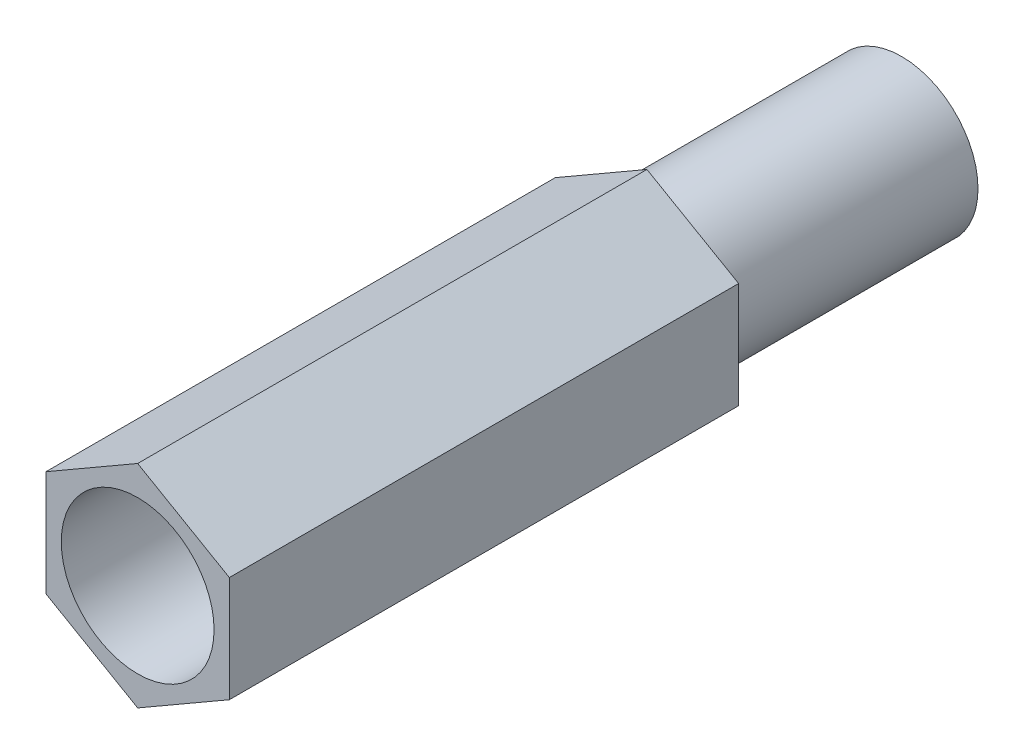
ISO-10303-21;
HEADER;
FILE_DESCRIPTION(('STEP AP214'),'2;1');
FILE_NAME('part.step','',(''),(''),'','','');
FILE_SCHEMA(('AUTOMOTIVE_DESIGN { 1 0 10303 214 1 1 1 1 }'));
ENDSEC;
DATA;
#1=APPLICATION_CONTEXT('core data for automotive mechanical design processes');
#2=APPLICATION_PROTOCOL_DEFINITION('international standard','automotive_design',2000,#1);
#3=PRODUCT_CONTEXT('',#1,'mechanical');
#4=PRODUCT('Part','Part','',(#3));
#5=PRODUCT_RELATED_PRODUCT_CATEGORY('part','',(#4));
#6=PRODUCT_DEFINITION_FORMATION('','',#4);
#7=PRODUCT_DEFINITION_CONTEXT('part definition',#1,'design');
#8=PRODUCT_DEFINITION('design','',#6,#7);
#9=PRODUCT_DEFINITION_SHAPE('','',#8);
#10=(LENGTH_UNIT() NAMED_UNIT(*) SI_UNIT(.MILLI.,.METRE.));
#11=(NAMED_UNIT(*) PLANE_ANGLE_UNIT() SI_UNIT($,.RADIAN.));
#12=(NAMED_UNIT(*) SI_UNIT($,.STERADIAN.) SOLID_ANGLE_UNIT());
#13=UNCERTAINTY_MEASURE_WITH_UNIT(LENGTH_MEASURE(1.E-05),#10,'distance_accuracy_value','');
#14=(GEOMETRIC_REPRESENTATION_CONTEXT(3) GLOBAL_UNCERTAINTY_ASSIGNED_CONTEXT((#13)) GLOBAL_UNIT_ASSIGNED_CONTEXT((#10,
#11,#12)) REPRESENTATION_CONTEXT('',''));
#15=CARTESIAN_POINT('',(0.,0.,0.));
#16=DIRECTION('',(0.,0.,1.));
#17=DIRECTION('',(1.,0.,0.));
#18=AXIS2_PLACEMENT_3D('',#15,#16,#17);
#19=CARTESIAN_POINT('',(0.,0.,10.));
#20=DIRECTION('',(0.,0.,-1.));
#21=DIRECTION('',(-1.,0.,0.));
#22=AXIS2_PLACEMENT_3D('',#19,#20,#21);
#23=CYLINDRICAL_SURFACE('',#22,1.5);
#24=CARTESIAN_POINT('',(0.,0.,10.));
#25=DIRECTION('',(0.,0.,1.));
#26=DIRECTION('',(1.,0.,0.));
#27=AXIS2_PLACEMENT_3D('',#24,#25,#26);
#28=CIRCLE('',#27,1.5);
#29=CARTESIAN_POINT('',(1.5,0.,10.));
#30=VERTEX_POINT('',#29);
#31=EDGE_CURVE('E141',#30,#30,#28,.T.);
#32=ORIENTED_EDGE('',*,*,#31,.T.);
#33=EDGE_LOOP('',(#32));
#34=FACE_BOUND('',#33,.T.);
#35=CARTESIAN_POINT('',(0.,0.,5.));
#36=DIRECTION('',(0.,0.,-1.));
#37=DIRECTION('',(-1.,0.,0.));
#38=AXIS2_PLACEMENT_3D('',#35,#36,#37);
#39=CIRCLE('',#38,1.5);
#40=CARTESIAN_POINT('',(-1.5,0.,5.));
#41=VERTEX_POINT('',#40);
#42=EDGE_CURVE('E258',#41,#41,#39,.T.);
#43=ORIENTED_EDGE('',*,*,#42,.T.);
#44=EDGE_LOOP('',(#43));
#45=FACE_BOUND('',#44,.T.);
#46=ADVANCED_FACE('F45',(#34,#45),#23,.F.);
#47=CARTESIAN_POINT('',(0.,0.,10.));
#48=DIRECTION('',(0.,0.,1.));
#49=DIRECTION('',(1.,0.,0.));
#50=AXIS2_PLACEMENT_3D('',#47,#48,#49);
#51=PLANE('',#50);
#52=DIRECTION('',(-0.866025403784439,0.5,0.));
#53=VECTOR('',#52,1.);
#54=CARTESIAN_POINT('',(1.8,1.03923048454133,10.));
#55=LINE('',#54,#53);
#56=CARTESIAN_POINT('',(1.8,1.03923048454133,10.));
#57=VERTEX_POINT('',#56);
#58=CARTESIAN_POINT('',(0.,2.07846096908265,10.));
#59=VERTEX_POINT('',#58);
#60=EDGE_CURVE('E153',#57,#59,#55,.T.);
#61=ORIENTED_EDGE('',*,*,#60,.T.);
#62=DIRECTION('',(-0.866025403784439,-0.5,0.));
#63=VECTOR('',#62,1.);
#64=CARTESIAN_POINT('',(0.,2.07846096908265,10.));
#65=LINE('',#64,#63);
#66=CARTESIAN_POINT('',(-1.8,1.03923048454133,10.));
#67=VERTEX_POINT('',#66);
#68=EDGE_CURVE('E100',#59,#67,#65,.T.);
#69=ORIENTED_EDGE('',*,*,#68,.T.);
#70=DIRECTION('',(0.,-1.,0.));
#71=VECTOR('',#70,1.);
#72=CARTESIAN_POINT('',(-1.8,1.03923048454133,10.));
#73=LINE('',#72,#71);
#74=CARTESIAN_POINT('',(-1.8,-1.03923048454133,10.));
#75=VERTEX_POINT('',#74);
#76=EDGE_CURVE('E114',#67,#75,#73,.T.);
#77=ORIENTED_EDGE('',*,*,#76,.T.);
#78=DIRECTION('',(0.866025403784439,-0.5,0.));
#79=VECTOR('',#78,1.);
#80=CARTESIAN_POINT('',(-1.8,-1.03923048454133,10.));
#81=LINE('',#80,#79);
#82=CARTESIAN_POINT('',(0.,-2.07846096908265,10.));
#83=VERTEX_POINT('',#82);
#84=EDGE_CURVE('E107',#75,#83,#81,.T.);
#85=ORIENTED_EDGE('',*,*,#84,.T.);
#86=DIRECTION('',(0.866025403784439,0.5,0.));
#87=VECTOR('',#86,1.);
#88=CARTESIAN_POINT('',(0.,-2.07846096908265,10.));
#89=LINE('',#88,#87);
#90=CARTESIAN_POINT('',(1.8,-1.03923048454133,10.));
#91=VERTEX_POINT('',#90);
#92=EDGE_CURVE('E112',#83,#91,#89,.T.);
#93=ORIENTED_EDGE('',*,*,#92,.T.);
#94=DIRECTION('',(0.,1.,0.));
#95=VECTOR('',#94,1.);
#96=CARTESIAN_POINT('',(1.8,-1.03923048454133,10.));
#97=LINE('',#96,#95);
#98=EDGE_CURVE('E63',#91,#57,#97,.T.);
#99=ORIENTED_EDGE('',*,*,#98,.T.);
#100=EDGE_LOOP('',(#61,#69,#77,#85,#93,#99));
#101=FACE_BOUND('',#100,.T.);
#102=ORIENTED_EDGE('',*,*,#31,.F.);
#103=EDGE_LOOP('',(#102));
#104=FACE_BOUND('',#103,.T.);
#105=ADVANCED_FACE('F109',(#101,#104),#51,.T.);
#106=CARTESIAN_POINT('',(0.,0.,0.));
#107=DIRECTION('',(0.,0.,1.));
#108=DIRECTION('',(1.,0.,0.));
#109=AXIS2_PLACEMENT_3D('',#106,#107,#108);
#110=PLANE('',#109);
#111=DIRECTION('',(-0.866025403784439,0.5,0.));
#112=VECTOR('',#111,1.);
#113=CARTESIAN_POINT('',(1.8,1.03923048454133,0.));
#114=LINE('',#113,#112);
#115=CARTESIAN_POINT('',(1.8,1.03923048454133,0.));
#116=VERTEX_POINT('',#115);
#117=CARTESIAN_POINT('',(0.,2.07846096908265,0.));
#118=VERTEX_POINT('',#117);
#119=EDGE_CURVE('E136',#116,#118,#114,.T.);
#120=ORIENTED_EDGE('',*,*,#119,.F.);
#121=DIRECTION('',(0.,1.,0.));
#122=VECTOR('',#121,1.);
#123=CARTESIAN_POINT('',(1.8,-1.03923048454133,0.));
#124=LINE('',#123,#122);
#125=CARTESIAN_POINT('',(1.8,-1.03923048454133,0.));
#126=VERTEX_POINT('',#125);
#127=EDGE_CURVE('E92',#126,#116,#124,.T.);
#128=ORIENTED_EDGE('',*,*,#127,.F.);
#129=DIRECTION('',(0.866025403784439,0.5,0.));
#130=VECTOR('',#129,1.);
#131=CARTESIAN_POINT('',(0.,-2.07846096908265,0.));
#132=LINE('',#131,#130);
#133=CARTESIAN_POINT('',(0.,-2.07846096908265,0.));
#134=VERTEX_POINT('',#133);
#135=EDGE_CURVE('E86',#134,#126,#132,.T.);
#136=ORIENTED_EDGE('',*,*,#135,.F.);
#137=DIRECTION('',(0.866025403784439,-0.5,0.));
#138=VECTOR('',#137,1.);
#139=CARTESIAN_POINT('',(-1.8,-1.03923048454133,0.));
#140=LINE('',#139,#138);
#141=CARTESIAN_POINT('',(-1.8,-1.03923048454133,0.));
#142=VERTEX_POINT('',#141);
#143=EDGE_CURVE('E123',#142,#134,#140,.T.);
#144=ORIENTED_EDGE('',*,*,#143,.F.);
#145=DIRECTION('',(0.,-1.,0.));
#146=VECTOR('',#145,1.);
#147=CARTESIAN_POINT('',(-1.8,1.03923048454133,0.));
#148=LINE('',#147,#146);
#149=CARTESIAN_POINT('',(-1.8,1.03923048454133,0.));
#150=VERTEX_POINT('',#149);
#151=EDGE_CURVE('E144',#150,#142,#148,.T.);
#152=ORIENTED_EDGE('',*,*,#151,.F.);
#153=DIRECTION('',(-0.866025403784439,-0.5,0.));
#154=VECTOR('',#153,1.);
#155=CARTESIAN_POINT('',(0.,2.07846096908265,0.));
#156=LINE('',#155,#154);
#157=EDGE_CURVE('E140',#118,#150,#156,.T.);
#158=ORIENTED_EDGE('',*,*,#157,.F.);
#159=EDGE_LOOP('',(#120,#128,#136,#144,#152,#158));
#160=FACE_BOUND('',#159,.T.);
#161=CARTESIAN_POINT('',(0.,0.,0.));
#162=DIRECTION('',(0.,0.,1.));
#163=DIRECTION('',(1.,0.,0.));
#164=AXIS2_PLACEMENT_3D('',#161,#162,#163);
#165=CIRCLE('',#164,1.5);
#166=CARTESIAN_POINT('',(1.5,0.,0.));
#167=VERTEX_POINT('',#166);
#168=EDGE_CURVE('E257',#167,#167,#165,.F.);
#169=ORIENTED_EDGE('',*,*,#168,.F.);
#170=EDGE_LOOP('',(#169));
#171=FACE_BOUND('',#170,.T.);
#172=ADVANCED_FACE('F166',(#160,#171),#110,.F.);
#173=CARTESIAN_POINT('',(1.8,1.03923048454133,10.));
#174=DIRECTION('',(-0.5,-0.866025403784439,0.));
#175=DIRECTION('',(0.866025403784439,-0.5,0.));
#176=AXIS2_PLACEMENT_3D('',#173,#174,#175);
#177=PLANE('',#176);
#178=ORIENTED_EDGE('',*,*,#119,.T.);
#179=DIRECTION('',(0.,0.,-1.));
#180=VECTOR('',#179,1.);
#181=CARTESIAN_POINT('',(0.,2.07846096908265,10.));
#182=LINE('',#181,#180);
#183=EDGE_CURVE('E11',#59,#118,#182,.T.);
#184=ORIENTED_EDGE('',*,*,#183,.F.);
#185=ORIENTED_EDGE('',*,*,#60,.F.);
#186=DIRECTION('',(0.,0.,-1.));
#187=VECTOR('',#186,1.);
#188=CARTESIAN_POINT('',(1.8,1.03923048454133,10.));
#189=LINE('',#188,#187);
#190=EDGE_CURVE('E132',#57,#116,#189,.T.);
#191=ORIENTED_EDGE('',*,*,#190,.T.);
#192=EDGE_LOOP('',(#178,#184,#185,#191));
#193=FACE_BOUND('',#192,.T.);
#194=ADVANCED_FACE('F47',(#193),#177,.F.);
#195=CARTESIAN_POINT('',(0.,2.07846096908265,10.));
#196=DIRECTION('',(0.5,-0.866025403784438,0.));
#197=DIRECTION('',(0.866025403784439,0.5,0.));
#198=AXIS2_PLACEMENT_3D('',#195,#196,#197);
#199=PLANE('',#198);
#200=ORIENTED_EDGE('',*,*,#157,.T.);
#201=DIRECTION('',(0.,0.,-1.));
#202=VECTOR('',#201,1.);
#203=CARTESIAN_POINT('',(-1.8,1.03923048454133,10.));
#204=LINE('',#203,#202);
#205=EDGE_CURVE('E55',#67,#150,#204,.T.);
#206=ORIENTED_EDGE('',*,*,#205,.F.);
#207=ORIENTED_EDGE('',*,*,#68,.F.);
#208=ORIENTED_EDGE('',*,*,#183,.T.);
#209=EDGE_LOOP('',(#200,#206,#207,#208));
#210=FACE_BOUND('',#209,.T.);
#211=ADVANCED_FACE('F198',(#210),#199,.F.);
#212=CARTESIAN_POINT('',(-1.8,1.03923048454133,10.));
#213=DIRECTION('',(1.,0.,0.));
#214=DIRECTION('',(0.,1.,0.));
#215=AXIS2_PLACEMENT_3D('',#212,#213,#214);
#216=PLANE('',#215);
#217=ORIENTED_EDGE('',*,*,#151,.T.);
#218=DIRECTION('',(0.,0.,-1.));
#219=VECTOR('',#218,1.);
#220=CARTESIAN_POINT('',(-1.8,-1.03923048454133,10.));
#221=LINE('',#220,#219);
#222=EDGE_CURVE('E125',#75,#142,#221,.T.);
#223=ORIENTED_EDGE('',*,*,#222,.F.);
#224=ORIENTED_EDGE('',*,*,#76,.F.);
#225=ORIENTED_EDGE('',*,*,#205,.T.);
#226=EDGE_LOOP('',(#217,#223,#224,#225));
#227=FACE_BOUND('',#226,.T.);
#228=ADVANCED_FACE('F163',(#227),#216,.F.);
#229=CARTESIAN_POINT('',(-1.8,-1.03923048454133,10.));
#230=DIRECTION('',(0.5,0.866025403784439,0.));
#231=DIRECTION('',(-0.866025403784439,0.5,0.));
#232=AXIS2_PLACEMENT_3D('',#229,#230,#231);
#233=PLANE('',#232);
#234=ORIENTED_EDGE('',*,*,#143,.T.);
#235=DIRECTION('',(0.,0.,-1.));
#236=VECTOR('',#235,1.);
#237=CARTESIAN_POINT('',(0.,-2.07846096908265,10.));
#238=LINE('',#237,#236);
#239=EDGE_CURVE('E120',#83,#134,#238,.T.);
#240=ORIENTED_EDGE('',*,*,#239,.F.);
#241=ORIENTED_EDGE('',*,*,#84,.F.);
#242=ORIENTED_EDGE('',*,*,#222,.T.);
#243=EDGE_LOOP('',(#234,#240,#241,#242));
#244=FACE_BOUND('',#243,.T.);
#245=ADVANCED_FACE('F121',(#244),#233,.F.);
#246=CARTESIAN_POINT('',(0.,-2.07846096908265,10.));
#247=DIRECTION('',(-0.5,0.866025403784439,0.));
#248=DIRECTION('',(-0.866025403784439,-0.5,0.));
#249=AXIS2_PLACEMENT_3D('',#246,#247,#248);
#250=PLANE('',#249);
#251=ORIENTED_EDGE('',*,*,#135,.T.);
#252=DIRECTION('',(0.,0.,-1.));
#253=VECTOR('',#252,1.);
#254=CARTESIAN_POINT('',(1.8,-1.03923048454133,10.));
#255=LINE('',#254,#253);
#256=EDGE_CURVE('E126',#91,#126,#255,.T.);
#257=ORIENTED_EDGE('',*,*,#256,.F.);
#258=ORIENTED_EDGE('',*,*,#92,.F.);
#259=ORIENTED_EDGE('',*,*,#239,.T.);
#260=EDGE_LOOP('',(#251,#257,#258,#259));
#261=FACE_BOUND('',#260,.T.);
#262=ADVANCED_FACE('F128',(#261),#250,.F.);
#263=CARTESIAN_POINT('',(1.8,-1.03923048454133,10.));
#264=DIRECTION('',(-1.,0.,0.));
#265=DIRECTION('',(0.,-1.,0.));
#266=AXIS2_PLACEMENT_3D('',#263,#264,#265);
#267=PLANE('',#266);
#268=ORIENTED_EDGE('',*,*,#127,.T.);
#269=ORIENTED_EDGE('',*,*,#190,.F.);
#270=ORIENTED_EDGE('',*,*,#98,.F.);
#271=ORIENTED_EDGE('',*,*,#256,.T.);
#272=EDGE_LOOP('',(#268,#269,#270,#271));
#273=FACE_BOUND('',#272,.T.);
#274=ADVANCED_FACE('F171',(#273),#267,.F.);
#275=CARTESIAN_POINT('',(0.,0.,5.));
#276=DIRECTION('',(0.,0.,-1.));
#277=DIRECTION('',(-1.,0.,0.));
#278=AXIS2_PLACEMENT_3D('',#275,#276,#277);
#279=PLANE('',#278);
#280=ORIENTED_EDGE('',*,*,#42,.F.);
#281=EDGE_LOOP('',(#280));
#282=FACE_BOUND('',#281,.T.);
#283=ADVANCED_FACE('F173',(#282),#279,.F.);
#284=CARTESIAN_POINT('',(0.,0.,-5.));
#285=DIRECTION('',(0.,0.,1.));
#286=DIRECTION('',(1.,0.,0.));
#287=AXIS2_PLACEMENT_3D('',#284,#285,#286);
#288=CYLINDRICAL_SURFACE('',#287,1.5);
#289=CARTESIAN_POINT('',(0.,0.,-5.));
#290=DIRECTION('',(0.,0.,-1.));
#291=DIRECTION('',(-1.,0.,0.));
#292=AXIS2_PLACEMENT_3D('',#289,#290,#291);
#293=CIRCLE('',#292,1.5);
#294=CARTESIAN_POINT('',(-1.5,0.,-5.));
#295=VERTEX_POINT('',#294);
#296=EDGE_CURVE('E255',#295,#295,#293,.T.);
#297=ORIENTED_EDGE('',*,*,#296,.F.);
#298=EDGE_LOOP('',(#297));
#299=FACE_BOUND('',#298,.T.);
#300=ORIENTED_EDGE('',*,*,#168,.T.);
#301=EDGE_LOOP('',(#300));
#302=FACE_BOUND('',#301,.T.);
#303=ADVANCED_FACE('F180',(#299,#302),#288,.T.);
#304=CARTESIAN_POINT('',(0.,0.,-5.));
#305=DIRECTION('',(0.,0.,-1.));
#306=DIRECTION('',(-1.,0.,0.));
#307=AXIS2_PLACEMENT_3D('',#304,#305,#306);
#308=PLANE('',#307);
#309=ORIENTED_EDGE('',*,*,#296,.T.);
#310=EDGE_LOOP('',(#309));
#311=FACE_BOUND('',#310,.T.);
#312=ADVANCED_FACE('F241',(#311),#308,.T.);
#313=CLOSED_SHELL('',(#46,#105,#172,#194,#211,#228,#245,#262,#274,#283,#303,#312));
#314=MANIFOLD_SOLID_BREP('B2',#313);
#315=ADVANCED_BREP_SHAPE_REPRESENTATION('',(#18,#314),#14);
#316=SHAPE_DEFINITION_REPRESENTATION(#9,#315);
ENDSEC;
END-ISO-10303-21;
